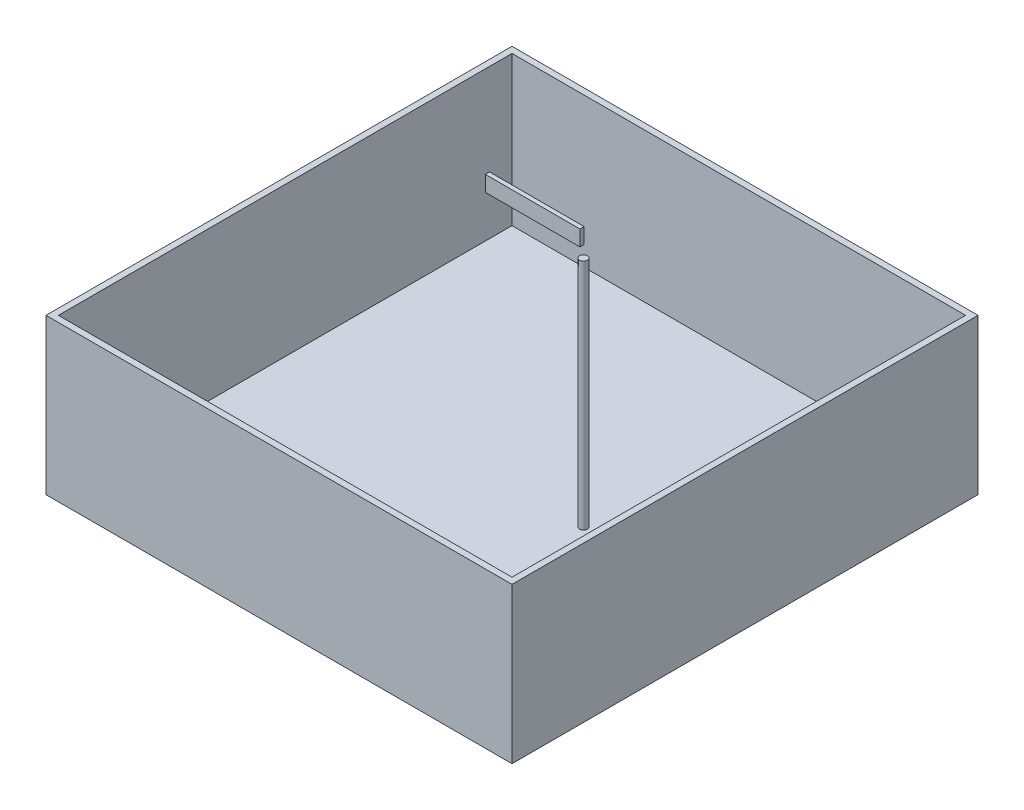
ISO-10303-21;
HEADER;
FILE_DESCRIPTION(('STEP AP214'),'2;1');
FILE_NAME('part.step','',(''),(''),'','','');
FILE_SCHEMA(('AUTOMOTIVE_DESIGN { 1 0 10303 214 1 1 1 1 }'));
ENDSEC;
DATA;
#1=APPLICATION_CONTEXT('core data for automotive mechanical design processes');
#2=APPLICATION_PROTOCOL_DEFINITION('international standard','automotive_design',2000,#1);
#3=PRODUCT_CONTEXT('',#1,'mechanical');
#4=PRODUCT('Part','Part','',(#3));
#5=PRODUCT_RELATED_PRODUCT_CATEGORY('part','',(#4));
#6=PRODUCT_DEFINITION_FORMATION('','',#4);
#7=PRODUCT_DEFINITION_CONTEXT('part definition',#1,'design');
#8=PRODUCT_DEFINITION('design','',#6,#7);
#9=PRODUCT_DEFINITION_SHAPE('','',#8);
#10=(LENGTH_UNIT() NAMED_UNIT(*) SI_UNIT(.MILLI.,.METRE.));
#11=(NAMED_UNIT(*) PLANE_ANGLE_UNIT() SI_UNIT($,.RADIAN.));
#12=(NAMED_UNIT(*) SI_UNIT($,.STERADIAN.) SOLID_ANGLE_UNIT());
#13=UNCERTAINTY_MEASURE_WITH_UNIT(LENGTH_MEASURE(1.E-05),#10,'distance_accuracy_value','');
#14=(GEOMETRIC_REPRESENTATION_CONTEXT(3) GLOBAL_UNCERTAINTY_ASSIGNED_CONTEXT((#13)) GLOBAL_UNIT_ASSIGNED_CONTEXT((#10,
#11,#12)) REPRESENTATION_CONTEXT('',''));
#15=CARTESIAN_POINT('',(0.,0.,0.));
#16=DIRECTION('',(0.,0.,1.));
#17=DIRECTION('',(1.,0.,0.));
#18=AXIS2_PLACEMENT_3D('',#15,#16,#17);
#19=CARTESIAN_POINT('',(-23.2021876458345,114.,144.3));
#20=DIRECTION('',(-1.,0.,0.));
#21=DIRECTION('',(0.,0.,1.));
#22=AXIS2_PLACEMENT_3D('',#19,#20,#21);
#23=PLANE('',#22);
#24=DIRECTION('',(0.,0.,-1.));
#25=VECTOR('',#24,1.);
#26=CARTESIAN_POINT('',(-23.2021876458345,104.,144.3));
#27=LINE('',#26,#25);
#28=CARTESIAN_POINT('',(-23.2021876458345,104.,144.3));
#29=VERTEX_POINT('',#28);
#30=CARTESIAN_POINT('',(-23.2021876458345,104.,141.594013099748));
#31=VERTEX_POINT('',#30);
#32=EDGE_CURVE('E114',#29,#31,#27,.T.);
#33=ORIENTED_EDGE('',*,*,#32,.F.);
#34=DIRECTION('',(0.,-1.,0.));
#35=VECTOR('',#34,1.);
#36=CARTESIAN_POINT('',(-23.2021876458345,114.,144.3));
#37=LINE('',#36,#35);
#38=CARTESIAN_POINT('',(-23.2021876458345,114.,144.3));
#39=VERTEX_POINT('',#38);
#40=EDGE_CURVE('E12',#39,#29,#37,.T.);
#41=ORIENTED_EDGE('',*,*,#40,.F.);
#42=DIRECTION('',(0.,0.,-1.));
#43=VECTOR('',#42,1.);
#44=CARTESIAN_POINT('',(-23.2021876458345,114.,144.3));
#45=LINE('',#44,#43);
#46=CARTESIAN_POINT('',(-23.2021876458345,114.,141.594013099748));
#47=VERTEX_POINT('',#46);
#48=EDGE_CURVE('E109',#39,#47,#45,.T.);
#49=ORIENTED_EDGE('',*,*,#48,.T.);
#50=DIRECTION('',(0.,-1.,0.));
#51=VECTOR('',#50,1.);
#52=CARTESIAN_POINT('',(-23.2021876458345,114.,141.594013099748));
#53=LINE('',#52,#51);
#54=EDGE_CURVE('E52',#47,#31,#53,.T.);
#55=ORIENTED_EDGE('',*,*,#54,.T.);
#56=EDGE_LOOP('',(#33,#41,#49,#55));
#57=FACE_BOUND('',#56,.T.);
#58=ADVANCED_FACE('F49',(#57),#23,.T.);
#59=CARTESIAN_POINT('',(-23.2021876458345,114.,144.3));
#60=DIRECTION('',(0.,0.,-1.));
#61=DIRECTION('',(-1.,0.,0.));
#62=AXIS2_PLACEMENT_3D('',#59,#60,#61);
#63=PLANE('',#62);
#64=DIRECTION('',(1.,0.,0.));
#65=VECTOR('',#64,1.);
#66=CARTESIAN_POINT('',(-23.2021876458345,104.,144.3));
#67=LINE('',#66,#65);
#68=CARTESIAN_POINT('',(37.7357778276939,104.,144.3));
#69=VERTEX_POINT('',#68);
#70=EDGE_CURVE('E82',#29,#69,#67,.T.);
#71=ORIENTED_EDGE('',*,*,#70,.T.);
#72=DIRECTION('',(0.,-1.,0.));
#73=VECTOR('',#72,1.);
#74=CARTESIAN_POINT('',(37.7357778276939,114.,144.3));
#75=LINE('',#74,#73);
#76=CARTESIAN_POINT('',(37.7357778276939,114.,144.3));
#77=VERTEX_POINT('',#76);
#78=EDGE_CURVE('E58',#77,#69,#75,.T.);
#79=ORIENTED_EDGE('',*,*,#78,.F.);
#80=DIRECTION('',(1.,0.,0.));
#81=VECTOR('',#80,1.);
#82=CARTESIAN_POINT('',(-23.2021876458345,114.,144.3));
#83=LINE('',#82,#81);
#84=EDGE_CURVE('E99',#39,#77,#83,.T.);
#85=ORIENTED_EDGE('',*,*,#84,.F.);
#86=ORIENTED_EDGE('',*,*,#40,.T.);
#87=EDGE_LOOP('',(#71,#79,#85,#86));
#88=FACE_BOUND('',#87,.T.);
#89=ADVANCED_FACE('F124',(#88),#63,.F.);
#90=CARTESIAN_POINT('',(37.7357778276939,114.,144.3));
#91=DIRECTION('',(-1.,0.,0.));
#92=DIRECTION('',(0.,0.,1.));
#93=AXIS2_PLACEMENT_3D('',#90,#91,#92);
#94=PLANE('',#93);
#95=DIRECTION('',(0.,0.,-1.));
#96=VECTOR('',#95,1.);
#97=CARTESIAN_POINT('',(37.7357778276939,104.,144.3));
#98=LINE('',#97,#96);
#99=CARTESIAN_POINT('',(37.7357778276939,104.,141.594013099748));
#100=VERTEX_POINT('',#99);
#101=EDGE_CURVE('E106',#69,#100,#98,.T.);
#102=ORIENTED_EDGE('',*,*,#101,.T.);
#103=DIRECTION('',(0.,-1.,0.));
#104=VECTOR('',#103,1.);
#105=CARTESIAN_POINT('',(37.7357778276939,114.,141.594013099748));
#106=LINE('',#105,#104);
#107=CARTESIAN_POINT('',(37.7357778276939,114.,141.594013099748));
#108=VERTEX_POINT('',#107);
#109=EDGE_CURVE('E103',#108,#100,#106,.T.);
#110=ORIENTED_EDGE('',*,*,#109,.F.);
#111=DIRECTION('',(0.,0.,-1.));
#112=VECTOR('',#111,1.);
#113=CARTESIAN_POINT('',(37.7357778276939,114.,144.3));
#114=LINE('',#113,#112);
#115=EDGE_CURVE('E94',#77,#108,#114,.T.);
#116=ORIENTED_EDGE('',*,*,#115,.F.);
#117=ORIENTED_EDGE('',*,*,#78,.T.);
#118=EDGE_LOOP('',(#102,#110,#116,#117));
#119=FACE_BOUND('',#118,.T.);
#120=ADVANCED_FACE('F104',(#119),#94,.F.);
#121=CARTESIAN_POINT('',(-23.2021876458345,114.,141.594013099748));
#122=DIRECTION('',(0.,0.,-1.));
#123=DIRECTION('',(-1.,0.,0.));
#124=AXIS2_PLACEMENT_3D('',#121,#122,#123);
#125=PLANE('',#124);
#126=DIRECTION('',(1.,0.,0.));
#127=VECTOR('',#126,1.);
#128=CARTESIAN_POINT('',(-23.2021876458345,104.,141.594013099748));
#129=LINE('',#128,#127);
#130=EDGE_CURVE('E117',#31,#100,#129,.T.);
#131=ORIENTED_EDGE('',*,*,#130,.F.);
#132=ORIENTED_EDGE('',*,*,#54,.F.);
#133=DIRECTION('',(1.,0.,0.));
#134=VECTOR('',#133,1.);
#135=CARTESIAN_POINT('',(-23.2021876458345,114.,141.594013099748));
#136=LINE('',#135,#134);
#137=EDGE_CURVE('E98',#47,#108,#136,.T.);
#138=ORIENTED_EDGE('',*,*,#137,.T.);
#139=ORIENTED_EDGE('',*,*,#109,.T.);
#140=EDGE_LOOP('',(#131,#132,#138,#139));
#141=FACE_BOUND('',#140,.T.);
#142=ADVANCED_FACE('F108',(#141),#125,.T.);
#143=CARTESIAN_POINT('',(0.,114.,0.));
#144=DIRECTION('',(0.,-1.,0.));
#145=DIRECTION('',(0.,0.,-1.));
#146=AXIS2_PLACEMENT_3D('',#143,#144,#145);
#147=PLANE('',#146);
#148=ORIENTED_EDGE('',*,*,#48,.F.);
#149=ORIENTED_EDGE('',*,*,#84,.T.);
#150=ORIENTED_EDGE('',*,*,#115,.T.);
#151=ORIENTED_EDGE('',*,*,#137,.F.);
#152=EDGE_LOOP('',(#148,#149,#150,#151));
#153=FACE_BOUND('',#152,.T.);
#154=ADVANCED_FACE('F97',(#153),#147,.F.);
#155=CARTESIAN_POINT('',(0.,104.,0.));
#156=DIRECTION('',(0.,-1.,0.));
#157=DIRECTION('',(0.,0.,-1.));
#158=AXIS2_PLACEMENT_3D('',#155,#156,#157);
#159=PLANE('',#158);
#160=ORIENTED_EDGE('',*,*,#32,.T.);
#161=ORIENTED_EDGE('',*,*,#130,.T.);
#162=ORIENTED_EDGE('',*,*,#101,.F.);
#163=ORIENTED_EDGE('',*,*,#70,.F.);
#164=EDGE_LOOP('',(#160,#161,#162,#163));
#165=FACE_BOUND('',#164,.T.);
#166=ADVANCED_FACE('F122',(#165),#159,.T.);
#167=CLOSED_SHELL('',(#58,#89,#120,#142,#154,#166));
#168=MANIFOLD_SOLID_BREP('B2_NOT_SHOWN',#167);
#169=CARTESIAN_POINT('',(-150.,50.,300.3));
#170=DIRECTION('',(0.,-1.,0.));
#171=DIRECTION('',(0.,0.,-1.));
#172=AXIS2_PLACEMENT_3D('',#169,#170,#171);
#173=PLANE('',#172);
#174=DIRECTION('',(-1.,0.,0.));
#175=VECTOR('',#174,1.);
#176=CARTESIAN_POINT('',(-150.,50.,0.3));
#177=LINE('',#176,#175);
#178=CARTESIAN_POINT('',(150.,50.,0.3));
#179=VERTEX_POINT('',#178);
#180=CARTESIAN_POINT('',(-150.,50.,0.3));
#181=VERTEX_POINT('',#180);
#182=EDGE_CURVE('E421',#179,#181,#177,.T.);
#183=ORIENTED_EDGE('',*,*,#182,.T.);
#184=DIRECTION('',(0.,0.,-1.));
#185=VECTOR('',#184,1.);
#186=CARTESIAN_POINT('',(-150.,50.,300.3));
#187=LINE('',#186,#185);
#188=CARTESIAN_POINT('',(-150.,50.,300.3));
#189=VERTEX_POINT('',#188);
#190=EDGE_CURVE('E431',#189,#181,#187,.T.);
#191=ORIENTED_EDGE('',*,*,#190,.F.);
#192=DIRECTION('',(-1.,0.,0.));
#193=VECTOR('',#192,1.);
#194=CARTESIAN_POINT('',(-150.,50.,300.3));
#195=LINE('',#194,#193);
#196=CARTESIAN_POINT('',(150.,50.,300.3));
#197=VERTEX_POINT('',#196);
#198=EDGE_CURVE('E411',#197,#189,#195,.T.);
#199=ORIENTED_EDGE('',*,*,#198,.F.);
#200=DIRECTION('',(0.,0.,-1.));
#201=VECTOR('',#200,1.);
#202=CARTESIAN_POINT('',(150.,50.,300.3));
#203=LINE('',#202,#201);
#204=EDGE_CURVE('E434',#197,#179,#203,.T.);
#205=ORIENTED_EDGE('',*,*,#204,.T.);
#206=EDGE_LOOP('',(#183,#191,#199,#205));
#207=FACE_BOUND('',#206,.T.);
#208=DIRECTION('',(-1.,0.,0.));
#209=VECTOR('',#208,1.);
#210=CARTESIAN_POINT('',(-150.,50.,4.30000000000003));
#211=LINE('',#210,#209);
#212=CARTESIAN_POINT('',(146.,50.,4.3));
#213=VERTEX_POINT('',#212);
#214=CARTESIAN_POINT('',(-146.,50.,4.3));
#215=VERTEX_POINT('',#214);
#216=EDGE_CURVE('E375',#213,#215,#211,.T.);
#217=ORIENTED_EDGE('',*,*,#216,.F.);
#218=DIRECTION('',(0.,0.,-1.));
#219=VECTOR('',#218,1.);
#220=CARTESIAN_POINT('',(146.,50.,300.3));
#221=LINE('',#220,#219);
#222=CARTESIAN_POINT('',(146.,50.,296.3));
#223=VERTEX_POINT('',#222);
#224=EDGE_CURVE('E401',#223,#213,#221,.T.);
#225=ORIENTED_EDGE('',*,*,#224,.F.);
#226=DIRECTION('',(-1.,0.,0.));
#227=VECTOR('',#226,1.);
#228=CARTESIAN_POINT('',(-150.,50.,296.3));
#229=LINE('',#228,#227);
#230=CARTESIAN_POINT('',(-146.,50.,296.3));
#231=VERTEX_POINT('',#230);
#232=EDGE_CURVE('E382',#223,#231,#229,.T.);
#233=ORIENTED_EDGE('',*,*,#232,.T.);
#234=DIRECTION('',(0.,0.,-1.));
#235=VECTOR('',#234,1.);
#236=CARTESIAN_POINT('',(-146.,50.,300.3));
#237=LINE('',#236,#235);
#238=EDGE_CURVE('E392',#231,#215,#237,.T.);
#239=ORIENTED_EDGE('',*,*,#238,.T.);
#240=EDGE_LOOP('',(#217,#225,#233,#239));
#241=FACE_BOUND('',#240,.T.);
#242=ADVANCED_FACE('F174',(#207,#241),#173,.F.);
#243=CARTESIAN_POINT('',(0.,-10.,-10.));
#244=DIRECTION('',(0.,1.,0.));
#245=DIRECTION('',(0.,0.,1.));
#246=AXIS2_PLACEMENT_3D('',#243,#244,#245);
#247=CYLINDRICAL_SURFACE('',#246,5.);
#248=DIRECTION('',(0.,1.,0.));
#249=VECTOR('',#248,1.);
#250=CARTESIAN_POINT('',(-5.,-10.,-10.));
#251=LINE('',#250,#249);
#252=CARTESIAN_POINT('',(-5.,-10.,-10.));
#253=VERTEX_POINT('',#252);
#254=CARTESIAN_POINT('',(-5.,-2.5,-10.));
#255=VERTEX_POINT('',#254);
#256=EDGE_CURVE('E500',#253,#255,#251,.T.);
#257=ORIENTED_EDGE('',*,*,#256,.T.);
#258=CARTESIAN_POINT('',(0.,-2.5,-10.));
#259=DIRECTION('',(0.,1.,0.));
#260=DIRECTION('',(0.,0.,1.));
#261=AXIS2_PLACEMENT_3D('',#258,#259,#260);
#262=CIRCLE('',#261,5.);
#263=CARTESIAN_POINT('',(5.,-2.5,-10.));
#264=VERTEX_POINT('',#263);
#265=EDGE_CURVE('E198',#255,#264,#262,.F.);
#266=ORIENTED_EDGE('',*,*,#265,.T.);
#267=DIRECTION('',(0.,1.,0.));
#268=VECTOR('',#267,1.);
#269=CARTESIAN_POINT('',(5.,-10.,-10.));
#270=LINE('',#269,#268);
#271=CARTESIAN_POINT('',(5.,-10.,-10.));
#272=VERTEX_POINT('',#271);
#273=EDGE_CURVE('E489',#272,#264,#270,.T.);
#274=ORIENTED_EDGE('',*,*,#273,.F.);
#275=CARTESIAN_POINT('',(0.,-10.,-10.));
#276=DIRECTION('',(0.,1.,0.));
#277=DIRECTION('',(0.,0.,1.));
#278=AXIS2_PLACEMENT_3D('',#275,#276,#277);
#279=CIRCLE('',#278,5.);
#280=EDGE_CURVE('E476',#272,#253,#279,.T.);
#281=ORIENTED_EDGE('',*,*,#280,.T.);
#282=EDGE_LOOP('',(#257,#266,#274,#281));
#283=FACE_BOUND('',#282,.T.);
#284=ADVANCED_FACE('F555',(#283),#247,.T.);
#285=CARTESIAN_POINT('',(0.,-10.,-10.));
#286=DIRECTION('',(0.,1.,0.));
#287=DIRECTION('',(0.,0.,1.));
#288=AXIS2_PLACEMENT_3D('',#285,#286,#287);
#289=CYLINDRICAL_SURFACE('',#288,2.5);
#290=CARTESIAN_POINT('',(0.,-10.,-10.));
#291=DIRECTION('',(0.,1.,0.));
#292=DIRECTION('',(0.,0.,1.));
#293=AXIS2_PLACEMENT_3D('',#290,#291,#292);
#294=CIRCLE('',#293,2.5);
#295=CARTESIAN_POINT('',(0.,-10.,-7.5));
#296=VERTEX_POINT('',#295);
#297=EDGE_CURVE('E473',#296,#296,#294,.T.);
#298=ORIENTED_EDGE('',*,*,#297,.F.);
#299=EDGE_LOOP('',(#298));
#300=FACE_BOUND('',#299,.T.);
#301=CARTESIAN_POINT('',(0.,-2.5,-10.));
#302=DIRECTION('',(0.,1.,0.));
#303=DIRECTION('',(0.,0.,1.));
#304=AXIS2_PLACEMENT_3D('',#301,#302,#303);
#305=CIRCLE('',#304,2.5);
#306=CARTESIAN_POINT('',(0.,-2.5,-7.5));
#307=VERTEX_POINT('',#306);
#308=EDGE_CURVE('E443',#307,#307,#305,.F.);
#309=ORIENTED_EDGE('',*,*,#308,.F.);
#310=EDGE_LOOP('',(#309));
#311=FACE_BOUND('',#310,.T.);
#312=ADVANCED_FACE('F561',(#300,#311),#289,.F.);
#313=CARTESIAN_POINT('',(0.,0.,0.));
#314=DIRECTION('',(0.,0.,1.));
#315=DIRECTION('',(1.,0.,0.));
#316=AXIS2_PLACEMENT_3D('',#313,#314,#315);
#317=PLANE('',#316);
#318=DIRECTION('',(0.,-1.,0.));
#319=VECTOR('',#318,1.);
#320=CARTESIAN_POINT('',(-20.,20.,0.));
#321=LINE('',#320,#319);
#322=CARTESIAN_POINT('',(-20.,20.,0.));
#323=VERTEX_POINT('',#322);
#324=CARTESIAN_POINT('',(-20.,-20.,0.));
#325=VERTEX_POINT('',#324);
#326=EDGE_CURVE('E492',#323,#325,#321,.T.);
#327=ORIENTED_EDGE('',*,*,#326,.F.);
#328=DIRECTION('',(1.,0.,0.));
#329=VECTOR('',#328,1.);
#330=CARTESIAN_POINT('',(-20.,20.,0.));
#331=LINE('',#330,#329);
#332=CARTESIAN_POINT('',(20.,20.,0.));
#333=VERTEX_POINT('',#332);
#334=EDGE_CURVE('E506',#323,#333,#331,.T.);
#335=ORIENTED_EDGE('',*,*,#334,.T.);
#336=DIRECTION('',(0.,-1.,0.));
#337=VECTOR('',#336,1.);
#338=CARTESIAN_POINT('',(20.,20.,0.));
#339=LINE('',#338,#337);
#340=CARTESIAN_POINT('',(20.,-20.,0.));
#341=VERTEX_POINT('',#340);
#342=EDGE_CURVE('E520',#333,#341,#339,.T.);
#343=ORIENTED_EDGE('',*,*,#342,.T.);
#344=DIRECTION('',(1.,0.,0.));
#345=VECTOR('',#344,1.);
#346=CARTESIAN_POINT('',(-20.,-20.,0.));
#347=LINE('',#346,#345);
#348=EDGE_CURVE('E517',#325,#341,#347,.T.);
#349=ORIENTED_EDGE('',*,*,#348,.F.);
#350=EDGE_LOOP('',(#327,#335,#343,#349));
#351=FACE_BOUND('',#350,.T.);
#352=DIRECTION('',(1.,0.,0.));
#353=VECTOR('',#352,1.);
#354=CARTESIAN_POINT('',(-5.,-10.,0.));
#355=LINE('',#354,#353);
#356=CARTESIAN_POINT('',(-5.,-10.,0.));
#357=VERTEX_POINT('',#356);
#358=CARTESIAN_POINT('',(5.,-10.,0.));
#359=VERTEX_POINT('',#358);
#360=EDGE_CURVE('E482',#357,#359,#355,.T.);
#361=ORIENTED_EDGE('',*,*,#360,.T.);
#362=DIRECTION('',(0.,1.,0.));
#363=VECTOR('',#362,1.);
#364=CARTESIAN_POINT('',(5.,-10.,0.));
#365=LINE('',#364,#363);
#366=CARTESIAN_POINT('',(5.,10.,0.));
#367=VERTEX_POINT('',#366);
#368=EDGE_CURVE('E494',#359,#367,#365,.T.);
#369=ORIENTED_EDGE('',*,*,#368,.T.);
#370=DIRECTION('',(1.,0.,0.));
#371=VECTOR('',#370,1.);
#372=CARTESIAN_POINT('',(-5.,10.,0.));
#373=LINE('',#372,#371);
#374=CARTESIAN_POINT('',(-5.,10.,0.));
#375=VERTEX_POINT('',#374);
#376=EDGE_CURVE('E468',#375,#367,#373,.T.);
#377=ORIENTED_EDGE('',*,*,#376,.F.);
#378=DIRECTION('',(0.,1.,0.));
#379=VECTOR('',#378,1.);
#380=CARTESIAN_POINT('',(-5.,-10.,0.));
#381=LINE('',#380,#379);
#382=EDGE_CURVE('E497',#357,#375,#381,.T.);
#383=ORIENTED_EDGE('',*,*,#382,.F.);
#384=EDGE_LOOP('',(#361,#369,#377,#383));
#385=FACE_BOUND('',#384,.T.);
#386=ADVANCED_FACE('F808',(#351,#385),#317,.F.);
#387=CARTESIAN_POINT('',(-20.,20.,0.3));
#388=DIRECTION('',(1.,0.,0.));
#389=DIRECTION('',(0.,1.,0.));
#390=AXIS2_PLACEMENT_3D('',#387,#388,#389);
#391=PLANE('',#390);
#392=ORIENTED_EDGE('',*,*,#326,.T.);
#393=DIRECTION('',(0.,0.,-1.));
#394=VECTOR('',#393,1.);
#395=CARTESIAN_POINT('',(-20.,-20.,0.3));
#396=LINE('',#395,#394);
#397=CARTESIAN_POINT('',(-20.,-20.,0.3));
#398=VERTEX_POINT('',#397);
#399=EDGE_CURVE('E183',#398,#325,#396,.T.);
#400=ORIENTED_EDGE('',*,*,#399,.F.);
#401=DIRECTION('',(0.,-1.,0.));
#402=VECTOR('',#401,1.);
#403=CARTESIAN_POINT('',(-20.,20.,0.3));
#404=LINE('',#403,#402);
#405=CARTESIAN_POINT('',(-20.,20.,0.3));
#406=VERTEX_POINT('',#405);
#407=EDGE_CURVE('E503',#406,#398,#404,.T.);
#408=ORIENTED_EDGE('',*,*,#407,.F.);
#409=DIRECTION('',(0.,0.,-1.));
#410=VECTOR('',#409,1.);
#411=CARTESIAN_POINT('',(-20.,20.,0.3));
#412=LINE('',#411,#410);
#413=EDGE_CURVE('E514',#406,#323,#412,.T.);
#414=ORIENTED_EDGE('',*,*,#413,.T.);
#415=EDGE_LOOP('',(#392,#400,#408,#414));
#416=FACE_BOUND('',#415,.T.);
#417=ADVANCED_FACE('F176',(#416),#391,.F.);
#418=CARTESIAN_POINT('',(-20.,-20.,0.3));
#419=DIRECTION('',(0.,1.,0.));
#420=DIRECTION('',(0.,0.,1.));
#421=AXIS2_PLACEMENT_3D('',#418,#419,#420);
#422=PLANE('',#421);
#423=ORIENTED_EDGE('',*,*,#348,.T.);
#424=DIRECTION('',(0.,0.,-1.));
#425=VECTOR('',#424,1.);
#426=CARTESIAN_POINT('',(20.,-20.,0.3));
#427=LINE('',#426,#425);
#428=CARTESIAN_POINT('',(20.,-20.,0.3));
#429=VERTEX_POINT('',#428);
#430=EDGE_CURVE('E528',#429,#341,#427,.T.);
#431=ORIENTED_EDGE('',*,*,#430,.F.);
#432=DIRECTION('',(1.,0.,0.));
#433=VECTOR('',#432,1.);
#434=CARTESIAN_POINT('',(-20.,-20.,0.3));
#435=LINE('',#434,#433);
#436=EDGE_CURVE('E505',#398,#429,#435,.T.);
#437=ORIENTED_EDGE('',*,*,#436,.F.);
#438=ORIENTED_EDGE('',*,*,#399,.T.);
#439=EDGE_LOOP('',(#423,#431,#437,#438));
#440=FACE_BOUND('',#439,.T.);
#441=ADVANCED_FACE('F790',(#440),#422,.F.);
#442=CARTESIAN_POINT('',(20.,20.,0.3));
#443=DIRECTION('',(1.,0.,0.));
#444=DIRECTION('',(0.,1.,0.));
#445=AXIS2_PLACEMENT_3D('',#442,#443,#444);
#446=PLANE('',#445);
#447=ORIENTED_EDGE('',*,*,#342,.F.);
#448=DIRECTION('',(0.,0.,-1.));
#449=VECTOR('',#448,1.);
#450=CARTESIAN_POINT('',(20.,20.,0.3));
#451=LINE('',#450,#449);
#452=CARTESIAN_POINT('',(20.,20.,0.3));
#453=VERTEX_POINT('',#452);
#454=EDGE_CURVE('E526',#453,#333,#451,.T.);
#455=ORIENTED_EDGE('',*,*,#454,.F.);
#456=DIRECTION('',(0.,-1.,0.));
#457=VECTOR('',#456,1.);
#458=CARTESIAN_POINT('',(20.,20.,0.3));
#459=LINE('',#458,#457);
#460=EDGE_CURVE('E508',#453,#429,#459,.T.);
#461=ORIENTED_EDGE('',*,*,#460,.T.);
#462=ORIENTED_EDGE('',*,*,#430,.T.);
#463=EDGE_LOOP('',(#447,#455,#461,#462));
#464=FACE_BOUND('',#463,.T.);
#465=ADVANCED_FACE('F778',(#464),#446,.T.);
#466=CARTESIAN_POINT('',(-20.,20.,0.3));
#467=DIRECTION('',(0.,1.,0.));
#468=DIRECTION('',(0.,0.,1.));
#469=AXIS2_PLACEMENT_3D('',#466,#467,#468);
#470=PLANE('',#469);
#471=ORIENTED_EDGE('',*,*,#334,.F.);
#472=ORIENTED_EDGE('',*,*,#413,.F.);
#473=DIRECTION('',(1.,0.,0.));
#474=VECTOR('',#473,1.);
#475=CARTESIAN_POINT('',(-20.,20.,0.3));
#476=LINE('',#475,#474);
#477=EDGE_CURVE('E511',#406,#453,#476,.T.);
#478=ORIENTED_EDGE('',*,*,#477,.T.);
#479=ORIENTED_EDGE('',*,*,#454,.T.);
#480=EDGE_LOOP('',(#471,#472,#478,#479));
#481=FACE_BOUND('',#480,.T.);
#482=ADVANCED_FACE('F773',(#481),#470,.T.);
#483=CARTESIAN_POINT('',(0.,2.5,-10.));
#484=DIRECTION('',(0.,1.,0.));
#485=DIRECTION('',(0.,0.,1.));
#486=AXIS2_PLACEMENT_3D('',#483,#484,#485);
#487=CIRCLE('',#486,5.);
#488=CARTESIAN_POINT('',(-5.,2.5,-10.));
#489=VERTEX_POINT('',#488);
#490=CARTESIAN_POINT('',(5.,2.5,-10.));
#491=VERTEX_POINT('',#490);
#492=EDGE_CURVE('E453',#489,#491,#487,.F.);
#493=ORIENTED_EDGE('',*,*,#492,.F.);
#494=CARTESIAN_POINT('',(-5.,10.,-10.));
#495=VERTEX_POINT('',#494);
#496=EDGE_CURVE('E488',#489,#495,#251,.T.);
#497=ORIENTED_EDGE('',*,*,#496,.T.);
#498=CARTESIAN_POINT('',(0.,10.,-10.));
#499=DIRECTION('',(0.,1.,0.));
#500=DIRECTION('',(0.,0.,1.));
#501=AXIS2_PLACEMENT_3D('',#498,#499,#500);
#502=CIRCLE('',#501,5.);
#503=CARTESIAN_POINT('',(5.,10.,-10.));
#504=VERTEX_POINT('',#503);
#505=EDGE_CURVE('E463',#504,#495,#502,.T.);
#506=ORIENTED_EDGE('',*,*,#505,.F.);
#507=EDGE_CURVE('E493',#491,#504,#270,.T.);
#508=ORIENTED_EDGE('',*,*,#507,.F.);
#509=EDGE_LOOP('',(#493,#497,#506,#508));
#510=FACE_BOUND('',#509,.T.);
#511=ADVANCED_FACE('F564',(#510),#247,.T.);
#512=CARTESIAN_POINT('',(5.,-10.,-10.));
#513=DIRECTION('',(1.,0.,0.));
#514=DIRECTION('',(0.,0.,-1.));
#515=AXIS2_PLACEMENT_3D('',#512,#513,#514);
#516=PLANE('',#515);
#517=DIRECTION('',(0.,0.,1.));
#518=VECTOR('',#517,1.);
#519=CARTESIAN_POINT('',(5.,2.5,-10.));
#520=LINE('',#519,#518);
#521=CARTESIAN_POINT('',(5.,2.5,-4.));
#522=VERTEX_POINT('',#521);
#523=EDGE_CURVE('E455',#491,#522,#520,.T.);
#524=ORIENTED_EDGE('',*,*,#523,.F.);
#525=ORIENTED_EDGE('',*,*,#507,.T.);
#526=DIRECTION('',(0.,0.,-1.));
#527=VECTOR('',#526,1.);
#528=CARTESIAN_POINT('',(5.,10.,-10.));
#529=LINE('',#528,#527);
#530=EDGE_CURVE('E470',#367,#504,#529,.T.);
#531=ORIENTED_EDGE('',*,*,#530,.F.);
#532=ORIENTED_EDGE('',*,*,#368,.F.);
#533=DIRECTION('',(0.,0.,-1.));
#534=VECTOR('',#533,1.);
#535=CARTESIAN_POINT('',(5.,-10.,-10.));
#536=LINE('',#535,#534);
#537=EDGE_CURVE('E485',#359,#272,#536,.T.);
#538=ORIENTED_EDGE('',*,*,#537,.T.);
#539=ORIENTED_EDGE('',*,*,#273,.T.);
#540=DIRECTION('',(0.,0.,1.));
#541=VECTOR('',#540,1.);
#542=CARTESIAN_POINT('',(5.,-2.5,-10.));
#543=LINE('',#542,#541);
#544=CARTESIAN_POINT('',(5.,-2.5,-4.));
#545=VERTEX_POINT('',#544);
#546=EDGE_CURVE('E447',#264,#545,#543,.T.);
#547=ORIENTED_EDGE('',*,*,#546,.T.);
#548=DIRECTION('',(0.,1.,0.));
#549=VECTOR('',#548,1.);
#550=CARTESIAN_POINT('',(5.,-10.,-4.));
#551=LINE('',#550,#549);
#552=EDGE_CURVE('E457',#545,#522,#551,.T.);
#553=ORIENTED_EDGE('',*,*,#552,.T.);
#554=EDGE_LOOP('',(#524,#525,#531,#532,#538,#539,#547,#553));
#555=FACE_BOUND('',#554,.T.);
#556=ADVANCED_FACE('F848',(#555),#516,.T.);
#557=CARTESIAN_POINT('',(-5.,-10.,-10.));
#558=DIRECTION('',(-1.,0.,0.));
#559=DIRECTION('',(0.,0.,1.));
#560=AXIS2_PLACEMENT_3D('',#557,#558,#559);
#561=PLANE('',#560);
#562=DIRECTION('',(0.,0.,-1.));
#563=VECTOR('',#562,1.);
#564=CARTESIAN_POINT('',(-5.,2.5,-10.));
#565=LINE('',#564,#563);
#566=CARTESIAN_POINT('',(-5.,2.5,-4.));
#567=VERTEX_POINT('',#566);
#568=EDGE_CURVE('E451',#567,#489,#565,.T.);
#569=ORIENTED_EDGE('',*,*,#568,.F.);
#570=DIRECTION('',(0.,-1.,0.));
#571=VECTOR('',#570,1.);
#572=CARTESIAN_POINT('',(-5.,-10.,-4.));
#573=LINE('',#572,#571);
#574=CARTESIAN_POINT('',(-5.,-2.5,-4.));
#575=VERTEX_POINT('',#574);
#576=EDGE_CURVE('E47',#567,#575,#573,.T.);
#577=ORIENTED_EDGE('',*,*,#576,.T.);
#578=DIRECTION('',(0.,0.,-1.));
#579=VECTOR('',#578,1.);
#580=CARTESIAN_POINT('',(-5.,-2.5,-10.));
#581=LINE('',#580,#579);
#582=EDGE_CURVE('E444',#575,#255,#581,.T.);
#583=ORIENTED_EDGE('',*,*,#582,.T.);
#584=ORIENTED_EDGE('',*,*,#256,.F.);
#585=DIRECTION('',(0.,0.,1.));
#586=VECTOR('',#585,1.);
#587=CARTESIAN_POINT('',(-5.,-10.,-10.));
#588=LINE('',#587,#586);
#589=EDGE_CURVE('E479',#253,#357,#588,.T.);
#590=ORIENTED_EDGE('',*,*,#589,.T.);
#591=ORIENTED_EDGE('',*,*,#382,.T.);
#592=DIRECTION('',(0.,0.,1.));
#593=VECTOR('',#592,1.);
#594=CARTESIAN_POINT('',(-5.,10.,-10.));
#595=LINE('',#594,#593);
#596=EDGE_CURVE('E466',#495,#375,#595,.T.);
#597=ORIENTED_EDGE('',*,*,#596,.F.);
#598=ORIENTED_EDGE('',*,*,#496,.F.);
#599=EDGE_LOOP('',(#569,#577,#583,#584,#590,#591,#597,#598));
#600=FACE_BOUND('',#599,.T.);
#601=ADVANCED_FACE('F843',(#600),#561,.T.);
#602=CARTESIAN_POINT('',(0.,-10.,-10.));
#603=DIRECTION('',(0.,1.,0.));
#604=DIRECTION('',(0.,0.,1.));
#605=AXIS2_PLACEMENT_3D('',#602,#603,#604);
#606=PLANE('',#605);
#607=ORIENTED_EDGE('',*,*,#297,.T.);
#608=EDGE_LOOP('',(#607));
#609=FACE_BOUND('',#608,.T.);
#610=ORIENTED_EDGE('',*,*,#280,.F.);
#611=ORIENTED_EDGE('',*,*,#537,.F.);
#612=ORIENTED_EDGE('',*,*,#360,.F.);
#613=ORIENTED_EDGE('',*,*,#589,.F.);
#614=EDGE_LOOP('',(#610,#611,#612,#613));
#615=FACE_BOUND('',#614,.T.);
#616=ADVANCED_FACE('F835',(#609,#615),#606,.F.);
#617=CARTESIAN_POINT('',(0.,2.5,-10.));
#618=DIRECTION('',(0.,1.,0.));
#619=DIRECTION('',(0.,0.,1.));
#620=AXIS2_PLACEMENT_3D('',#617,#618,#619);
#621=CIRCLE('',#620,2.5);
#622=CARTESIAN_POINT('',(0.,2.5,-7.5));
#623=VERTEX_POINT('',#622);
#624=EDGE_CURVE('E450',#623,#623,#621,.F.);
#625=ORIENTED_EDGE('',*,*,#624,.T.);
#626=EDGE_LOOP('',(#625));
#627=FACE_BOUND('',#626,.T.);
#628=CARTESIAN_POINT('',(0.,10.,-10.));
#629=DIRECTION('',(0.,1.,0.));
#630=DIRECTION('',(0.,0.,1.));
#631=AXIS2_PLACEMENT_3D('',#628,#629,#630);
#632=CIRCLE('',#631,2.5);
#633=CARTESIAN_POINT('',(0.,10.,-7.5));
#634=VERTEX_POINT('',#633);
#635=EDGE_CURVE('E460',#634,#634,#632,.T.);
#636=ORIENTED_EDGE('',*,*,#635,.T.);
#637=EDGE_LOOP('',(#636));
#638=FACE_BOUND('',#637,.T.);
#639=ADVANCED_FACE('F536',(#627,#638),#289,.F.);
#640=CARTESIAN_POINT('',(0.,10.,-10.));
#641=DIRECTION('',(0.,1.,0.));
#642=DIRECTION('',(0.,0.,1.));
#643=AXIS2_PLACEMENT_3D('',#640,#641,#642);
#644=PLANE('',#643);
#645=ORIENTED_EDGE('',*,*,#505,.T.);
#646=ORIENTED_EDGE('',*,*,#596,.T.);
#647=ORIENTED_EDGE('',*,*,#376,.T.);
#648=ORIENTED_EDGE('',*,*,#530,.T.);
#649=EDGE_LOOP('',(#645,#646,#647,#648));
#650=FACE_BOUND('',#649,.T.);
#651=ORIENTED_EDGE('',*,*,#635,.F.);
#652=EDGE_LOOP('',(#651));
#653=FACE_BOUND('',#652,.T.);
#654=ADVANCED_FACE('F542',(#650,#653),#644,.T.);
#655=CARTESIAN_POINT('',(0.,2.5,0.));
#656=DIRECTION('',(0.,1.,0.));
#657=DIRECTION('',(0.,0.,1.));
#658=AXIS2_PLACEMENT_3D('',#655,#656,#657);
#659=PLANE('',#658);
#660=ORIENTED_EDGE('',*,*,#523,.T.);
#661=DIRECTION('',(1.,0.,0.));
#662=VECTOR('',#661,1.);
#663=CARTESIAN_POINT('',(-7.02807757222276,2.5,-4.));
#664=LINE('',#663,#662);
#665=EDGE_CURVE('E440',#567,#522,#664,.T.);
#666=ORIENTED_EDGE('',*,*,#665,.F.);
#667=ORIENTED_EDGE('',*,*,#568,.T.);
#668=ORIENTED_EDGE('',*,*,#492,.T.);
#669=EDGE_LOOP('',(#660,#666,#667,#668));
#670=FACE_BOUND('',#669,.T.);
#671=ORIENTED_EDGE('',*,*,#624,.F.);
#672=EDGE_LOOP('',(#671));
#673=FACE_BOUND('',#672,.T.);
#674=ADVANCED_FACE('F539',(#670,#673),#659,.F.);
#675=CARTESIAN_POINT('',(0.,-2.5,0.));
#676=DIRECTION('',(0.,1.,0.));
#677=DIRECTION('',(0.,0.,1.));
#678=AXIS2_PLACEMENT_3D('',#675,#676,#677);
#679=PLANE('',#678);
#680=ORIENTED_EDGE('',*,*,#265,.F.);
#681=ORIENTED_EDGE('',*,*,#582,.F.);
#682=DIRECTION('',(1.,0.,0.));
#683=VECTOR('',#682,1.);
#684=CARTESIAN_POINT('',(-7.02807757222276,-2.5,-4.));
#685=LINE('',#684,#683);
#686=EDGE_CURVE('E437',#575,#545,#685,.T.);
#687=ORIENTED_EDGE('',*,*,#686,.T.);
#688=ORIENTED_EDGE('',*,*,#546,.F.);
#689=EDGE_LOOP('',(#680,#681,#687,#688));
#690=FACE_BOUND('',#689,.T.);
#691=ORIENTED_EDGE('',*,*,#308,.T.);
#692=EDGE_LOOP('',(#691));
#693=FACE_BOUND('',#692,.T.);
#694=ADVANCED_FACE('F541',(#690,#693),#679,.T.);
#695=CARTESIAN_POINT('',(-7.02807757222276,2.5,-4.));
#696=DIRECTION('',(0.,0.,-1.));
#697=DIRECTION('',(-1.,0.,0.));
#698=AXIS2_PLACEMENT_3D('',#695,#696,#697);
#699=PLANE('',#698);
#700=ORIENTED_EDGE('',*,*,#686,.F.);
#701=ORIENTED_EDGE('',*,*,#576,.F.);
#702=ORIENTED_EDGE('',*,*,#665,.T.);
#703=ORIENTED_EDGE('',*,*,#552,.F.);
#704=EDGE_LOOP('',(#700,#701,#702,#703));
#705=FACE_BOUND('',#704,.T.);
#706=ADVANCED_FACE('F549',(#705),#699,.T.);
#707=CARTESIAN_POINT('',(0.,0.,0.3));
#708=DIRECTION('',(0.,0.,1.));
#709=DIRECTION('',(1.,0.,0.));
#710=AXIS2_PLACEMENT_3D('',#707,#708,#709);
#711=PLANE('',#710);
#712=DIRECTION('',(0.,1.,0.));
#713=VECTOR('',#712,1.);
#714=CARTESIAN_POINT('',(150.,50.,0.3));
#715=LINE('',#714,#713);
#716=CARTESIAN_POINT('',(150.,-50.,0.3));
#717=VERTEX_POINT('',#716);
#718=EDGE_CURVE('E407',#717,#179,#715,.T.);
#719=ORIENTED_EDGE('',*,*,#718,.F.);
#720=DIRECTION('',(1.,0.,0.));
#721=VECTOR('',#720,1.);
#722=CARTESIAN_POINT('',(-150.,-50.,0.3));
#723=LINE('',#722,#721);
#724=CARTESIAN_POINT('',(-150.,-50.,0.3));
#725=VERTEX_POINT('',#724);
#726=EDGE_CURVE('E412',#725,#717,#723,.T.);
#727=ORIENTED_EDGE('',*,*,#726,.F.);
#728=DIRECTION('',(0.,-1.,0.));
#729=VECTOR('',#728,1.);
#730=CARTESIAN_POINT('',(-150.,50.,0.3));
#731=LINE('',#730,#729);
#732=EDGE_CURVE('E423',#181,#725,#731,.T.);
#733=ORIENTED_EDGE('',*,*,#732,.F.);
#734=ORIENTED_EDGE('',*,*,#182,.F.);
#735=EDGE_LOOP('',(#719,#727,#733,#734));
#736=FACE_BOUND('',#735,.T.);
#737=ORIENTED_EDGE('',*,*,#477,.F.);
#738=ORIENTED_EDGE('',*,*,#407,.T.);
#739=ORIENTED_EDGE('',*,*,#436,.T.);
#740=ORIENTED_EDGE('',*,*,#460,.F.);
#741=EDGE_LOOP('',(#737,#738,#739,#740));
#742=FACE_BOUND('',#741,.T.);
#743=ADVANCED_FACE('F572',(#736,#742),#711,.F.);
#744=CARTESIAN_POINT('',(150.,50.,300.3));
#745=DIRECTION('',(-1.,0.,0.));
#746=DIRECTION('',(0.,0.,1.));
#747=AXIS2_PLACEMENT_3D('',#744,#745,#746);
#748=PLANE('',#747);
#749=ORIENTED_EDGE('',*,*,#718,.T.);
#750=ORIENTED_EDGE('',*,*,#204,.F.);
#751=DIRECTION('',(0.,1.,0.));
#752=VECTOR('',#751,1.);
#753=CARTESIAN_POINT('',(150.,50.,300.3));
#754=LINE('',#753,#752);
#755=CARTESIAN_POINT('',(150.,-50.,300.3));
#756=VERTEX_POINT('',#755);
#757=EDGE_CURVE('E408',#756,#197,#754,.T.);
#758=ORIENTED_EDGE('',*,*,#757,.F.);
#759=DIRECTION('',(0.,0.,-1.));
#760=VECTOR('',#759,1.);
#761=CARTESIAN_POINT('',(150.,-50.,300.3));
#762=LINE('',#761,#760);
#763=EDGE_CURVE('E418',#756,#717,#762,.T.);
#764=ORIENTED_EDGE('',*,*,#763,.T.);
#765=EDGE_LOOP('',(#749,#750,#758,#764));
#766=FACE_BOUND('',#765,.T.);
#767=ADVANCED_FACE('F570',(#766),#748,.F.);
#768=CARTESIAN_POINT('',(-150.,50.,300.3));
#769=DIRECTION('',(1.,0.,0.));
#770=DIRECTION('',(0.,0.,-1.));
#771=AXIS2_PLACEMENT_3D('',#768,#769,#770);
#772=PLANE('',#771);
#773=ORIENTED_EDGE('',*,*,#732,.T.);
#774=DIRECTION('',(0.,0.,-1.));
#775=VECTOR('',#774,1.);
#776=CARTESIAN_POINT('',(-150.,-50.,300.3));
#777=LINE('',#776,#775);
#778=CARTESIAN_POINT('',(-150.,-50.,300.3));
#779=VERTEX_POINT('',#778);
#780=EDGE_CURVE('E428',#779,#725,#777,.T.);
#781=ORIENTED_EDGE('',*,*,#780,.F.);
#782=DIRECTION('',(0.,-1.,0.));
#783=VECTOR('',#782,1.);
#784=CARTESIAN_POINT('',(-150.,50.,300.3));
#785=LINE('',#784,#783);
#786=EDGE_CURVE('E414',#189,#779,#785,.T.);
#787=ORIENTED_EDGE('',*,*,#786,.F.);
#788=ORIENTED_EDGE('',*,*,#190,.T.);
#789=EDGE_LOOP('',(#773,#781,#787,#788));
#790=FACE_BOUND('',#789,.T.);
#791=ADVANCED_FACE('F568',(#790),#772,.F.);
#792=CARTESIAN_POINT('',(-150.,-50.,300.3));
#793=DIRECTION('',(0.,1.,0.));
#794=DIRECTION('',(0.,0.,1.));
#795=AXIS2_PLACEMENT_3D('',#792,#793,#794);
#796=PLANE('',#795);
#797=ORIENTED_EDGE('',*,*,#726,.T.);
#798=ORIENTED_EDGE('',*,*,#763,.F.);
#799=DIRECTION('',(1.,0.,0.));
#800=VECTOR('',#799,1.);
#801=CARTESIAN_POINT('',(-150.,-50.,300.3));
#802=LINE('',#801,#800);
#803=EDGE_CURVE('E416',#779,#756,#802,.T.);
#804=ORIENTED_EDGE('',*,*,#803,.F.);
#805=ORIENTED_EDGE('',*,*,#780,.T.);
#806=EDGE_LOOP('',(#797,#798,#804,#805));
#807=FACE_BOUND('',#806,.T.);
#808=ADVANCED_FACE('F578',(#807),#796,.F.);
#809=CARTESIAN_POINT('',(0.,0.,300.3));
#810=DIRECTION('',(0.,0.,1.));
#811=DIRECTION('',(1.,0.,0.));
#812=AXIS2_PLACEMENT_3D('',#809,#810,#811);
#813=PLANE('',#812);
#814=ORIENTED_EDGE('',*,*,#757,.T.);
#815=ORIENTED_EDGE('',*,*,#198,.T.);
#816=ORIENTED_EDGE('',*,*,#786,.T.);
#817=ORIENTED_EDGE('',*,*,#803,.T.);
#818=EDGE_LOOP('',(#814,#815,#816,#817));
#819=FACE_BOUND('',#818,.T.);
#820=ADVANCED_FACE('F592',(#819),#813,.T.);
#821=CARTESIAN_POINT('',(0.,0.,4.3));
#822=DIRECTION('',(0.,0.,1.));
#823=DIRECTION('',(1.,0.,0.));
#824=AXIS2_PLACEMENT_3D('',#821,#822,#823);
#825=PLANE('',#824);
#826=DIRECTION('',(0.,1.,0.));
#827=VECTOR('',#826,1.);
#828=CARTESIAN_POINT('',(146.,50.,4.30000000000003));
#829=LINE('',#828,#827);
#830=CARTESIAN_POINT('',(146.,-46.,4.3));
#831=VERTEX_POINT('',#830);
#832=EDGE_CURVE('E372',#831,#213,#829,.T.);
#833=ORIENTED_EDGE('',*,*,#832,.T.);
#834=ORIENTED_EDGE('',*,*,#216,.T.);
#835=DIRECTION('',(0.,-1.,0.));
#836=VECTOR('',#835,1.);
#837=CARTESIAN_POINT('',(-146.,50.,4.30000000000003));
#838=LINE('',#837,#836);
#839=CARTESIAN_POINT('',(-146.,-46.,4.3));
#840=VERTEX_POINT('',#839);
#841=EDGE_CURVE('E379',#215,#840,#838,.T.);
#842=ORIENTED_EDGE('',*,*,#841,.T.);
#843=DIRECTION('',(1.,0.,0.));
#844=VECTOR('',#843,1.);
#845=CARTESIAN_POINT('',(-150.,-46.,4.30000000000003));
#846=LINE('',#845,#844);
#847=EDGE_CURVE('E377',#840,#831,#846,.T.);
#848=ORIENTED_EDGE('',*,*,#847,.T.);
#849=EDGE_LOOP('',(#833,#834,#842,#848));
#850=FACE_BOUND('',#849,.T.);
#851=ADVANCED_FACE('F600',(#850),#825,.T.);
#852=CARTESIAN_POINT('',(146.,50.,300.3));
#853=DIRECTION('',(-1.,0.,0.));
#854=DIRECTION('',(0.,0.,1.));
#855=AXIS2_PLACEMENT_3D('',#852,#853,#854);
#856=PLANE('',#855);
#857=ORIENTED_EDGE('',*,*,#832,.F.);
#858=DIRECTION('',(0.,0.,-1.));
#859=VECTOR('',#858,1.);
#860=CARTESIAN_POINT('',(146.,-46.,300.3));
#861=LINE('',#860,#859);
#862=CARTESIAN_POINT('',(146.,-46.,296.3));
#863=VERTEX_POINT('',#862);
#864=EDGE_CURVE('E383',#863,#831,#861,.T.);
#865=ORIENTED_EDGE('',*,*,#864,.F.);
#866=DIRECTION('',(0.,1.,0.));
#867=VECTOR('',#866,1.);
#868=CARTESIAN_POINT('',(146.,50.,296.3));
#869=LINE('',#868,#867);
#870=EDGE_CURVE('E190',#863,#223,#869,.T.);
#871=ORIENTED_EDGE('',*,*,#870,.T.);
#872=ORIENTED_EDGE('',*,*,#224,.T.);
#873=EDGE_LOOP('',(#857,#865,#871,#872));
#874=FACE_BOUND('',#873,.T.);
#875=ADVANCED_FACE('F615',(#874),#856,.T.);
#876=CARTESIAN_POINT('',(-146.,50.,300.3));
#877=DIRECTION('',(1.,0.,0.));
#878=DIRECTION('',(0.,0.,-1.));
#879=AXIS2_PLACEMENT_3D('',#876,#877,#878);
#880=PLANE('',#879);
#881=ORIENTED_EDGE('',*,*,#841,.F.);
#882=ORIENTED_EDGE('',*,*,#238,.F.);
#883=DIRECTION('',(0.,-1.,0.));
#884=VECTOR('',#883,1.);
#885=CARTESIAN_POINT('',(-146.,50.,296.3));
#886=LINE('',#885,#884);
#887=CARTESIAN_POINT('',(-146.,-46.,296.3));
#888=VERTEX_POINT('',#887);
#889=EDGE_CURVE('E389',#231,#888,#886,.T.);
#890=ORIENTED_EDGE('',*,*,#889,.T.);
#891=DIRECTION('',(0.,0.,-1.));
#892=VECTOR('',#891,1.);
#893=CARTESIAN_POINT('',(-146.,-46.,300.3));
#894=LINE('',#893,#892);
#895=EDGE_CURVE('E386',#888,#840,#894,.T.);
#896=ORIENTED_EDGE('',*,*,#895,.T.);
#897=EDGE_LOOP('',(#881,#882,#890,#896));
#898=FACE_BOUND('',#897,.T.);
#899=ADVANCED_FACE('F611',(#898),#880,.T.);
#900=CARTESIAN_POINT('',(-150.,-46.,300.3));
#901=DIRECTION('',(0.,1.,0.));
#902=DIRECTION('',(0.,0.,1.));
#903=AXIS2_PLACEMENT_3D('',#900,#901,#902);
#904=PLANE('',#903);
#905=CARTESIAN_POINT('',(45.,-46.,149.3));
#906=DIRECTION('',(0.,1.,0.));
#907=DIRECTION('',(0.,0.,1.));
#908=AXIS2_PLACEMENT_3D('',#905,#906,#907);
#909=CIRCLE('',#908,2.50000000000001);
#910=CARTESIAN_POINT('',(45.,-46.,151.8));
#911=VERTEX_POINT('',#910);
#912=EDGE_CURVE('E651',#911,#911,#909,.T.);
#913=ORIENTED_EDGE('',*,*,#912,.F.);
#914=EDGE_LOOP('',(#913));
#915=FACE_BOUND('',#914,.T.);
#916=ORIENTED_EDGE('',*,*,#847,.F.);
#917=ORIENTED_EDGE('',*,*,#895,.F.);
#918=DIRECTION('',(1.,0.,0.));
#919=VECTOR('',#918,1.);
#920=CARTESIAN_POINT('',(-150.,-46.,296.3));
#921=LINE('',#920,#919);
#922=EDGE_CURVE('E387',#888,#863,#921,.T.);
#923=ORIENTED_EDGE('',*,*,#922,.T.);
#924=ORIENTED_EDGE('',*,*,#864,.T.);
#925=EDGE_LOOP('',(#916,#917,#923,#924));
#926=FACE_BOUND('',#925,.T.);
#927=ADVANCED_FACE('F607',(#915,#926),#904,.T.);
#928=CARTESIAN_POINT('',(0.,0.,296.3));
#929=DIRECTION('',(0.,0.,1.));
#930=DIRECTION('',(1.,0.,0.));
#931=AXIS2_PLACEMENT_3D('',#928,#929,#930);
#932=PLANE('',#931);
#933=ORIENTED_EDGE('',*,*,#870,.F.);
#934=ORIENTED_EDGE('',*,*,#922,.F.);
#935=ORIENTED_EDGE('',*,*,#889,.F.);
#936=ORIENTED_EDGE('',*,*,#232,.F.);
#937=EDGE_LOOP('',(#933,#934,#935,#936));
#938=FACE_BOUND('',#937,.T.);
#939=ADVANCED_FACE('F603',(#938),#932,.F.);
#940=CARTESIAN_POINT('',(45.,104.,149.3));
#941=DIRECTION('',(0.,-1.,0.));
#942=DIRECTION('',(0.,0.,-1.));
#943=AXIS2_PLACEMENT_3D('',#940,#941,#942);
#944=CYLINDRICAL_SURFACE('',#943,2.50000000000001);
#945=CARTESIAN_POINT('',(45.,104.,149.3));
#946=DIRECTION('',(0.,1.,0.));
#947=DIRECTION('',(0.,0.,1.));
#948=AXIS2_PLACEMENT_3D('',#945,#946,#947);
#949=CIRCLE('',#948,2.50000000000001);
#950=CARTESIAN_POINT('',(45.,104.,151.8));
#951=VERTEX_POINT('',#950);
#952=EDGE_CURVE('E376',#951,#951,#949,.T.);
#953=ORIENTED_EDGE('',*,*,#952,.F.);
#954=EDGE_LOOP('',(#953));
#955=FACE_BOUND('',#954,.T.);
#956=ORIENTED_EDGE('',*,*,#912,.T.);
#957=EDGE_LOOP('',(#956));
#958=FACE_BOUND('',#957,.T.);
#959=ADVANCED_FACE('F606',(#955,#958),#944,.T.);
#960=CARTESIAN_POINT('',(45.,104.,149.3));
#961=DIRECTION('',(0.,1.,0.));
#962=DIRECTION('',(0.,0.,1.));
#963=AXIS2_PLACEMENT_3D('',#960,#961,#962);
#964=PLANE('',#963);
#965=ORIENTED_EDGE('',*,*,#952,.T.);
#966=EDGE_LOOP('',(#965));
#967=FACE_BOUND('',#966,.T.);
#968=ADVANCED_FACE('F643',(#967),#964,.T.);
#969=CLOSED_SHELL('',(#242,#284,#312,#386,#417,#441,#465,#482,#511,#556,#601,#616,#639,#654,
#674,#694,#706,#743,#767,#791,#808,#820,#851,#875,#899,#927,#939,#959,#968));
#970=CARTESIAN_POINT('',(0.,0.,4.));
#971=DIRECTION('',(0.,0.,-1.));
#972=DIRECTION('',(-1.,0.,0.));
#973=AXIS2_PLACEMENT_3D('',#970,#971,#972);
#974=PLANE('',#973);
#975=DIRECTION('',(0.,1.,0.));
#976=VECTOR('',#975,1.);
#977=CARTESIAN_POINT('',(1.,0.,4.));
#978=LINE('',#977,#976);
#979=CARTESIAN_POINT('',(1.,-6.,4.));
#980=VERTEX_POINT('',#979);
#981=CARTESIAN_POINT('',(1.,6.,4.));
#982=VERTEX_POINT('',#981);
#983=EDGE_CURVE('E337',#980,#982,#978,.T.);
#984=ORIENTED_EDGE('',*,*,#983,.F.);
#985=DIRECTION('',(1.,0.,0.));
#986=VECTOR('',#985,1.);
#987=CARTESIAN_POINT('',(0.,-6.,4.));
#988=LINE('',#987,#986);
#989=CARTESIAN_POINT('',(-1.,-6.,4.));
#990=VERTEX_POINT('',#989);
#991=EDGE_CURVE('E369',#990,#980,#988,.T.);
#992=ORIENTED_EDGE('',*,*,#991,.F.);
#993=DIRECTION('',(0.,1.,0.));
#994=VECTOR('',#993,1.);
#995=CARTESIAN_POINT('',(-1.,-10.,4.));
#996=LINE('',#995,#994);
#997=CARTESIAN_POINT('',(-1.,6.,4.));
#998=VERTEX_POINT('',#997);
#999=EDGE_CURVE('E350',#990,#998,#996,.T.);
#1000=ORIENTED_EDGE('',*,*,#999,.T.);
#1001=DIRECTION('',(1.,0.,0.));
#1002=VECTOR('',#1001,1.);
#1003=CARTESIAN_POINT('',(0.,6.,4.));
#1004=LINE('',#1003,#1002);
#1005=EDGE_CURVE('E356',#998,#982,#1004,.T.);
#1006=ORIENTED_EDGE('',*,*,#1005,.T.);
#1007=EDGE_LOOP('',(#984,#992,#1000,#1006));
#1008=FACE_BOUND('',#1007,.T.);
#1009=ADVANCED_FACE('F361',(#1008),#974,.T.);
#1010=CARTESIAN_POINT('',(-7.02807757222276,2.5,0.));
#1011=DIRECTION('',(0.,0.,-1.));
#1012=DIRECTION('',(-1.,0.,0.));
#1013=AXIS2_PLACEMENT_3D('',#1010,#1011,#1012);
#1014=PLANE('',#1013);
#1015=DIRECTION('',(0.,-1.,0.));
#1016=VECTOR('',#1015,1.);
#1017=CARTESIAN_POINT('',(-1.,-10.,0.));
#1018=LINE('',#1017,#1016);
#1019=CARTESIAN_POINT('',(-1.,6.,0.));
#1020=VERTEX_POINT('',#1019);
#1021=CARTESIAN_POINT('',(-1.,-6.,0.));
#1022=VERTEX_POINT('',#1021);
#1023=EDGE_CURVE('E349',#1020,#1022,#1018,.T.);
#1024=ORIENTED_EDGE('',*,*,#1023,.T.);
#1025=DIRECTION('',(-1.,0.,0.));
#1026=VECTOR('',#1025,1.);
#1027=CARTESIAN_POINT('',(0.,-6.,0.));
#1028=LINE('',#1027,#1026);
#1029=CARTESIAN_POINT('',(1.,-6.,0.));
#1030=VERTEX_POINT('',#1029);
#1031=EDGE_CURVE('E396',#1030,#1022,#1028,.T.);
#1032=ORIENTED_EDGE('',*,*,#1031,.F.);
#1033=DIRECTION('',(0.,1.,0.));
#1034=VECTOR('',#1033,1.);
#1035=CARTESIAN_POINT('',(1.,-10.,0.));
#1036=LINE('',#1035,#1034);
#1037=CARTESIAN_POINT('',(1.,6.,0.));
#1038=VERTEX_POINT('',#1037);
#1039=EDGE_CURVE('E365',#1030,#1038,#1036,.T.);
#1040=ORIENTED_EDGE('',*,*,#1039,.T.);
#1041=DIRECTION('',(1.,0.,0.));
#1042=VECTOR('',#1041,1.);
#1043=CARTESIAN_POINT('',(-7.02807757222276,6.,0.));
#1044=LINE('',#1043,#1042);
#1045=EDGE_CURVE('E358',#1020,#1038,#1044,.T.);
#1046=ORIENTED_EDGE('',*,*,#1045,.F.);
#1047=EDGE_LOOP('',(#1024,#1032,#1040,#1046));
#1048=FACE_BOUND('',#1047,.T.);
#1049=ADVANCED_FACE('F622',(#1048),#1014,.F.);
#1050=CARTESIAN_POINT('',(0.,-6.,-10.));
#1051=DIRECTION('',(0.,1.,0.));
#1052=DIRECTION('',(0.,0.,1.));
#1053=AXIS2_PLACEMENT_3D('',#1050,#1051,#1052);
#1054=PLANE('',#1053);
#1055=ORIENTED_EDGE('',*,*,#1031,.T.);
#1056=DIRECTION('',(0.,0.,1.));
#1057=VECTOR('',#1056,1.);
#1058=CARTESIAN_POINT('',(-1.,-6.,-10.));
#1059=LINE('',#1058,#1057);
#1060=EDGE_CURVE('E359',#1022,#990,#1059,.T.);
#1061=ORIENTED_EDGE('',*,*,#1060,.T.);
#1062=ORIENTED_EDGE('',*,*,#991,.T.);
#1063=DIRECTION('',(0.,0.,-1.));
#1064=VECTOR('',#1063,1.);
#1065=CARTESIAN_POINT('',(1.,-6.,-10.));
#1066=LINE('',#1065,#1064);
#1067=EDGE_CURVE('E344',#980,#1030,#1066,.T.);
#1068=ORIENTED_EDGE('',*,*,#1067,.T.);
#1069=EDGE_LOOP('',(#1055,#1061,#1062,#1068));
#1070=FACE_BOUND('',#1069,.T.);
#1071=ADVANCED_FACE('F625',(#1070),#1054,.T.);
#1072=CARTESIAN_POINT('',(0.,6.,-10.));
#1073=DIRECTION('',(0.,1.,0.));
#1074=DIRECTION('',(0.,0.,1.));
#1075=AXIS2_PLACEMENT_3D('',#1072,#1073,#1074);
#1076=PLANE('',#1075);
#1077=ORIENTED_EDGE('',*,*,#1045,.T.);
#1078=DIRECTION('',(0.,0.,-1.));
#1079=VECTOR('',#1078,1.);
#1080=CARTESIAN_POINT('',(1.,6.,-10.));
#1081=LINE('',#1080,#1079);
#1082=EDGE_CURVE('E341',#982,#1038,#1081,.T.);
#1083=ORIENTED_EDGE('',*,*,#1082,.F.);
#1084=ORIENTED_EDGE('',*,*,#1005,.F.);
#1085=DIRECTION('',(0.,0.,1.));
#1086=VECTOR('',#1085,1.);
#1087=CARTESIAN_POINT('',(-1.,6.,-10.));
#1088=LINE('',#1087,#1086);
#1089=EDGE_CURVE('E363',#1020,#998,#1088,.T.);
#1090=ORIENTED_EDGE('',*,*,#1089,.F.);
#1091=EDGE_LOOP('',(#1077,#1083,#1084,#1090));
#1092=FACE_BOUND('',#1091,.T.);
#1093=ADVANCED_FACE('F354',(#1092),#1076,.F.);
#1094=CARTESIAN_POINT('',(-1.,-10.,-10.));
#1095=DIRECTION('',(-1.,0.,0.));
#1096=DIRECTION('',(0.,0.,1.));
#1097=AXIS2_PLACEMENT_3D('',#1094,#1095,#1096);
#1098=PLANE('',#1097);
#1099=ORIENTED_EDGE('',*,*,#1089,.T.);
#1100=ORIENTED_EDGE('',*,*,#999,.F.);
#1101=ORIENTED_EDGE('',*,*,#1060,.F.);
#1102=ORIENTED_EDGE('',*,*,#1023,.F.);
#1103=EDGE_LOOP('',(#1099,#1100,#1101,#1102));
#1104=FACE_BOUND('',#1103,.T.);
#1105=ADVANCED_FACE('F630',(#1104),#1098,.F.);
#1106=CARTESIAN_POINT('',(1.,-10.,-10.));
#1107=DIRECTION('',(1.,0.,0.));
#1108=DIRECTION('',(0.,0.,-1.));
#1109=AXIS2_PLACEMENT_3D('',#1106,#1107,#1108);
#1110=PLANE('',#1109);
#1111=ORIENTED_EDGE('',*,*,#1039,.F.);
#1112=ORIENTED_EDGE('',*,*,#1067,.F.);
#1113=ORIENTED_EDGE('',*,*,#983,.T.);
#1114=ORIENTED_EDGE('',*,*,#1082,.T.);
#1115=EDGE_LOOP('',(#1111,#1112,#1113,#1114));
#1116=FACE_BOUND('',#1115,.T.);
#1117=ADVANCED_FACE('F340',(#1116),#1110,.F.);
#1118=CLOSED_SHELL('',(#1009,#1049,#1071,#1093,#1105,#1117));
#1119=ORIENTED_CLOSED_SHELL('',*,#1118,.T.);
#1120=BREP_WITH_VOIDS('B6',#969,(#1119));
#1121=ADVANCED_BREP_SHAPE_REPRESENTATION('',(#18,#168,#1120),#14);
#1122=SHAPE_DEFINITION_REPRESENTATION(#9,#1121);
ENDSEC;
END-ISO-10303-21;
